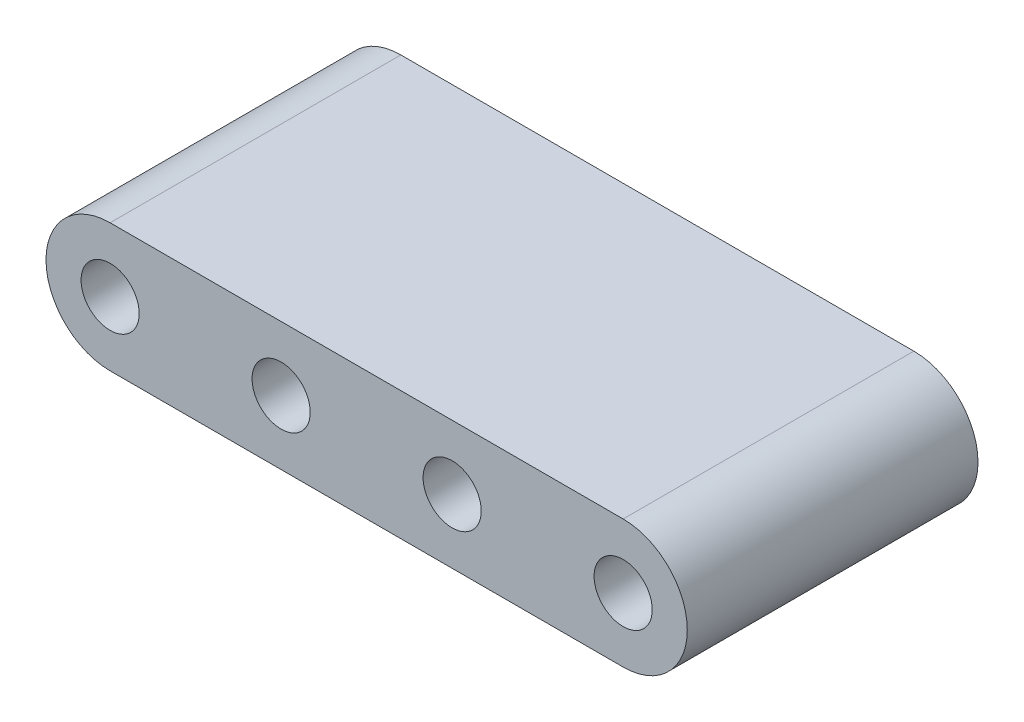
ISO-10303-21;
HEADER;
FILE_DESCRIPTION(('STEP AP214'),'2;1');
FILE_NAME('part.step','',(''),(''),'','','');
FILE_SCHEMA(('AUTOMOTIVE_DESIGN { 1 0 10303 214 1 1 1 1 }'));
ENDSEC;
DATA;
#1=APPLICATION_CONTEXT('core data for automotive mechanical design processes');
#2=APPLICATION_PROTOCOL_DEFINITION('international standard','automotive_design',2000,#1);
#3=PRODUCT_CONTEXT('',#1,'mechanical');
#4=PRODUCT('Part','Part','',(#3));
#5=PRODUCT_RELATED_PRODUCT_CATEGORY('part','',(#4));
#6=PRODUCT_DEFINITION_FORMATION('','',#4);
#7=PRODUCT_DEFINITION_CONTEXT('part definition',#1,'design');
#8=PRODUCT_DEFINITION('design','',#6,#7);
#9=PRODUCT_DEFINITION_SHAPE('','',#8);
#10=(LENGTH_UNIT() NAMED_UNIT(*) SI_UNIT(.MILLI.,.METRE.));
#11=(NAMED_UNIT(*) PLANE_ANGLE_UNIT() SI_UNIT($,.RADIAN.));
#12=(NAMED_UNIT(*) SI_UNIT($,.STERADIAN.) SOLID_ANGLE_UNIT());
#13=UNCERTAINTY_MEASURE_WITH_UNIT(LENGTH_MEASURE(1.E-05),#10,'distance_accuracy_value','');
#14=(GEOMETRIC_REPRESENTATION_CONTEXT(3) GLOBAL_UNCERTAINTY_ASSIGNED_CONTEXT((#13)) GLOBAL_UNIT_ASSIGNED_CONTEXT((#10,
#11,#12)) REPRESENTATION_CONTEXT('',''));
#15=CARTESIAN_POINT('',(0.,0.,0.));
#16=DIRECTION('',(0.,0.,1.));
#17=DIRECTION('',(1.,0.,0.));
#18=AXIS2_PLACEMENT_3D('',#15,#16,#17);
#19=CARTESIAN_POINT('',(0.,0.,34.));
#20=DIRECTION('',(0.,0.,1.));
#21=DIRECTION('',(1.,0.,0.));
#22=AXIS2_PLACEMENT_3D('',#19,#20,#21);
#23=PLANE('',#22);
#24=CARTESIAN_POINT('',(40.,0.,34.));
#25=DIRECTION('',(0.,0.,1.));
#26=DIRECTION('',(1.,0.,0.));
#27=AXIS2_PLACEMENT_3D('',#24,#25,#26);
#28=CIRCLE('',#27,3.4);
#29=CARTESIAN_POINT('',(43.4,0.,34.));
#30=VERTEX_POINT('',#29);
#31=EDGE_CURVE('E131',#30,#30,#28,.T.);
#32=ORIENTED_EDGE('',*,*,#31,.F.);
#33=EDGE_LOOP('',(#32));
#34=FACE_BOUND('',#33,.T.);
#35=CARTESIAN_POINT('',(0.,0.,34.));
#36=DIRECTION('',(0.,0.,1.));
#37=DIRECTION('',(1.,0.,0.));
#38=AXIS2_PLACEMENT_3D('',#35,#36,#37);
#39=CIRCLE('',#38,3.4);
#40=CARTESIAN_POINT('',(3.4,0.,34.));
#41=VERTEX_POINT('',#40);
#42=EDGE_CURVE('E110',#41,#41,#39,.T.);
#43=ORIENTED_EDGE('',*,*,#42,.F.);
#44=EDGE_LOOP('',(#43));
#45=FACE_BOUND('',#44,.T.);
#46=CARTESIAN_POINT('',(0.,0.,34.));
#47=DIRECTION('',(0.,0.,1.));
#48=DIRECTION('',(1.,0.,0.));
#49=AXIS2_PLACEMENT_3D('',#46,#47,#48);
#50=CIRCLE('',#49,7.5);
#51=CARTESIAN_POINT('',(0.,7.5,34.));
#52=VERTEX_POINT('',#51);
#53=CARTESIAN_POINT('',(0.,-7.5,34.));
#54=VERTEX_POINT('',#53);
#55=EDGE_CURVE('E95',#52,#54,#50,.T.);
#56=ORIENTED_EDGE('',*,*,#55,.T.);
#57=DIRECTION('',(1.,0.,0.));
#58=VECTOR('',#57,1.);
#59=CARTESIAN_POINT('',(0.,-7.5,34.));
#60=LINE('',#59,#58);
#61=CARTESIAN_POINT('',(60.,-7.5,34.));
#62=VERTEX_POINT('',#61);
#63=EDGE_CURVE('E90',#54,#62,#60,.T.);
#64=ORIENTED_EDGE('',*,*,#63,.T.);
#65=CARTESIAN_POINT('',(60.,0.,34.));
#66=DIRECTION('',(0.,0.,1.));
#67=DIRECTION('',(1.,0.,0.));
#68=AXIS2_PLACEMENT_3D('',#65,#66,#67);
#69=CIRCLE('',#68,7.5);
#70=CARTESIAN_POINT('',(60.,7.5,34.));
#71=VERTEX_POINT('',#70);
#72=EDGE_CURVE('E93',#62,#71,#69,.T.);
#73=ORIENTED_EDGE('',*,*,#72,.T.);
#74=DIRECTION('',(-1.,0.,0.));
#75=VECTOR('',#74,1.);
#76=CARTESIAN_POINT('',(0.,7.5,34.));
#77=LINE('',#76,#75);
#78=EDGE_CURVE('E60',#71,#52,#77,.T.);
#79=ORIENTED_EDGE('',*,*,#78,.T.);
#80=EDGE_LOOP('',(#56,#64,#73,#79));
#81=FACE_BOUND('',#80,.T.);
#82=CARTESIAN_POINT('',(20.,0.,34.));
#83=DIRECTION('',(0.,0.,1.));
#84=DIRECTION('',(1.,0.,0.));
#85=AXIS2_PLACEMENT_3D('',#82,#83,#84);
#86=CIRCLE('',#85,3.4);
#87=CARTESIAN_POINT('',(23.4,0.,34.));
#88=VERTEX_POINT('',#87);
#89=EDGE_CURVE('E125',#88,#88,#86,.T.);
#90=ORIENTED_EDGE('',*,*,#89,.F.);
#91=EDGE_LOOP('',(#90));
#92=FACE_BOUND('',#91,.T.);
#93=CARTESIAN_POINT('',(60.,0.,34.));
#94=DIRECTION('',(0.,0.,1.));
#95=DIRECTION('',(1.,0.,0.));
#96=AXIS2_PLACEMENT_3D('',#93,#94,#95);
#97=CIRCLE('',#96,3.4);
#98=CARTESIAN_POINT('',(63.4,0.,34.));
#99=VERTEX_POINT('',#98);
#100=EDGE_CURVE('E137',#99,#99,#97,.T.);
#101=ORIENTED_EDGE('',*,*,#100,.F.);
#102=EDGE_LOOP('',(#101));
#103=FACE_BOUND('',#102,.T.);
#104=ADVANCED_FACE('F43',(#34,#45,#81,#92,#103),#23,.T.);
#105=CARTESIAN_POINT('',(0.,0.,0.));
#106=DIRECTION('',(0.,0.,1.));
#107=DIRECTION('',(1.,0.,0.));
#108=AXIS2_PLACEMENT_3D('',#105,#106,#107);
#109=PLANE('',#108);
#110=CARTESIAN_POINT('',(0.,0.,0.));
#111=DIRECTION('',(0.,0.,1.));
#112=DIRECTION('',(1.,0.,0.));
#113=AXIS2_PLACEMENT_3D('',#110,#111,#112);
#114=CIRCLE('',#113,7.5);
#115=CARTESIAN_POINT('',(0.,7.5,0.));
#116=VERTEX_POINT('',#115);
#117=CARTESIAN_POINT('',(0.,-7.5,0.));
#118=VERTEX_POINT('',#117);
#119=EDGE_CURVE('E107',#116,#118,#114,.T.);
#120=ORIENTED_EDGE('',*,*,#119,.F.);
#121=DIRECTION('',(-1.,0.,0.));
#122=VECTOR('',#121,1.);
#123=CARTESIAN_POINT('',(0.,7.5,0.));
#124=LINE('',#123,#122);
#125=CARTESIAN_POINT('',(60.,7.5,0.));
#126=VERTEX_POINT('',#125);
#127=EDGE_CURVE('E83',#126,#116,#124,.T.);
#128=ORIENTED_EDGE('',*,*,#127,.F.);
#129=CARTESIAN_POINT('',(60.,0.,0.));
#130=DIRECTION('',(0.,0.,1.));
#131=DIRECTION('',(1.,0.,0.));
#132=AXIS2_PLACEMENT_3D('',#129,#130,#131);
#133=CIRCLE('',#132,7.5);
#134=CARTESIAN_POINT('',(60.,-7.5,0.));
#135=VERTEX_POINT('',#134);
#136=EDGE_CURVE('E77',#135,#126,#133,.T.);
#137=ORIENTED_EDGE('',*,*,#136,.F.);
#138=DIRECTION('',(1.,0.,0.));
#139=VECTOR('',#138,1.);
#140=CARTESIAN_POINT('',(0.,-7.5,0.));
#141=LINE('',#140,#139);
#142=EDGE_CURVE('E99',#118,#135,#141,.T.);
#143=ORIENTED_EDGE('',*,*,#142,.F.);
#144=EDGE_LOOP('',(#120,#128,#137,#143));
#145=FACE_BOUND('',#144,.T.);
#146=CARTESIAN_POINT('',(0.,0.,0.));
#147=DIRECTION('',(0.,0.,1.));
#148=DIRECTION('',(1.,0.,0.));
#149=AXIS2_PLACEMENT_3D('',#146,#147,#148);
#150=CIRCLE('',#149,3.4);
#151=CARTESIAN_POINT('',(3.4,0.,0.));
#152=VERTEX_POINT('',#151);
#153=EDGE_CURVE('E122',#152,#152,#150,.T.);
#154=ORIENTED_EDGE('',*,*,#153,.T.);
#155=EDGE_LOOP('',(#154));
#156=FACE_BOUND('',#155,.T.);
#157=CARTESIAN_POINT('',(20.,0.,0.));
#158=DIRECTION('',(0.,0.,1.));
#159=DIRECTION('',(1.,0.,0.));
#160=AXIS2_PLACEMENT_3D('',#157,#158,#159);
#161=CIRCLE('',#160,3.4);
#162=CARTESIAN_POINT('',(23.4,0.,0.));
#163=VERTEX_POINT('',#162);
#164=EDGE_CURVE('E128',#163,#163,#161,.T.);
#165=ORIENTED_EDGE('',*,*,#164,.T.);
#166=EDGE_LOOP('',(#165));
#167=FACE_BOUND('',#166,.T.);
#168=CARTESIAN_POINT('',(40.,0.,0.));
#169=DIRECTION('',(0.,0.,1.));
#170=DIRECTION('',(1.,0.,0.));
#171=AXIS2_PLACEMENT_3D('',#168,#169,#170);
#172=CIRCLE('',#171,3.4);
#173=CARTESIAN_POINT('',(43.4,0.,0.));
#174=VERTEX_POINT('',#173);
#175=EDGE_CURVE('E134',#174,#174,#172,.T.);
#176=ORIENTED_EDGE('',*,*,#175,.T.);
#177=EDGE_LOOP('',(#176));
#178=FACE_BOUND('',#177,.T.);
#179=CARTESIAN_POINT('',(60.,0.,0.));
#180=DIRECTION('',(0.,0.,1.));
#181=DIRECTION('',(1.,0.,0.));
#182=AXIS2_PLACEMENT_3D('',#179,#180,#181);
#183=CIRCLE('',#182,3.4);
#184=CARTESIAN_POINT('',(63.4,0.,0.));
#185=VERTEX_POINT('',#184);
#186=EDGE_CURVE('E140',#185,#185,#183,.T.);
#187=ORIENTED_EDGE('',*,*,#186,.T.);
#188=EDGE_LOOP('',(#187));
#189=FACE_BOUND('',#188,.T.);
#190=ADVANCED_FACE('F118',(#145,#156,#167,#178,#189),#109,.F.);
#191=CARTESIAN_POINT('',(0.,0.,34.));
#192=DIRECTION('',(0.,0.,-1.));
#193=DIRECTION('',(-1.,0.,0.));
#194=AXIS2_PLACEMENT_3D('',#191,#192,#193);
#195=CYLINDRICAL_SURFACE('',#194,7.5);
#196=ORIENTED_EDGE('',*,*,#119,.T.);
#197=DIRECTION('',(0.,0.,-1.));
#198=VECTOR('',#197,1.);
#199=CARTESIAN_POINT('',(0.,-7.5,34.));
#200=LINE('',#199,#198);
#201=EDGE_CURVE('E11',#54,#118,#200,.T.);
#202=ORIENTED_EDGE('',*,*,#201,.F.);
#203=ORIENTED_EDGE('',*,*,#55,.F.);
#204=DIRECTION('',(0.,0.,-1.));
#205=VECTOR('',#204,1.);
#206=CARTESIAN_POINT('',(0.,7.5,34.));
#207=LINE('',#206,#205);
#208=EDGE_CURVE('E103',#52,#116,#207,.T.);
#209=ORIENTED_EDGE('',*,*,#208,.T.);
#210=EDGE_LOOP('',(#196,#202,#203,#209));
#211=FACE_BOUND('',#210,.T.);
#212=ADVANCED_FACE('F45',(#211),#195,.T.);
#213=CARTESIAN_POINT('',(0.,-7.5,34.));
#214=DIRECTION('',(0.,1.,0.));
#215=DIRECTION('',(0.,0.,1.));
#216=AXIS2_PLACEMENT_3D('',#213,#214,#215);
#217=PLANE('',#216);
#218=ORIENTED_EDGE('',*,*,#142,.T.);
#219=DIRECTION('',(0.,0.,-1.));
#220=VECTOR('',#219,1.);
#221=CARTESIAN_POINT('',(60.,-7.5,34.));
#222=LINE('',#221,#220);
#223=EDGE_CURVE('E52',#62,#135,#222,.T.);
#224=ORIENTED_EDGE('',*,*,#223,.F.);
#225=ORIENTED_EDGE('',*,*,#63,.F.);
#226=ORIENTED_EDGE('',*,*,#201,.T.);
#227=EDGE_LOOP('',(#218,#224,#225,#226));
#228=FACE_BOUND('',#227,.T.);
#229=ADVANCED_FACE('F98',(#228),#217,.F.);
#230=CARTESIAN_POINT('',(60.,0.,34.));
#231=DIRECTION('',(0.,0.,-1.));
#232=DIRECTION('',(-1.,0.,0.));
#233=AXIS2_PLACEMENT_3D('',#230,#231,#232);
#234=CYLINDRICAL_SURFACE('',#233,7.5);
#235=ORIENTED_EDGE('',*,*,#136,.T.);
#236=DIRECTION('',(0.,0.,-1.));
#237=VECTOR('',#236,1.);
#238=CARTESIAN_POINT('',(60.,7.5,34.));
#239=LINE('',#238,#237);
#240=EDGE_CURVE('E100',#71,#126,#239,.T.);
#241=ORIENTED_EDGE('',*,*,#240,.F.);
#242=ORIENTED_EDGE('',*,*,#72,.F.);
#243=ORIENTED_EDGE('',*,*,#223,.T.);
#244=EDGE_LOOP('',(#235,#241,#242,#243));
#245=FACE_BOUND('',#244,.T.);
#246=ADVANCED_FACE('F101',(#245),#234,.T.);
#247=CARTESIAN_POINT('',(0.,7.5,34.));
#248=DIRECTION('',(0.,-1.,0.));
#249=DIRECTION('',(0.,0.,-1.));
#250=AXIS2_PLACEMENT_3D('',#247,#248,#249);
#251=PLANE('',#250);
#252=ORIENTED_EDGE('',*,*,#127,.T.);
#253=ORIENTED_EDGE('',*,*,#208,.F.);
#254=ORIENTED_EDGE('',*,*,#78,.F.);
#255=ORIENTED_EDGE('',*,*,#240,.T.);
#256=EDGE_LOOP('',(#252,#253,#254,#255));
#257=FACE_BOUND('',#256,.T.);
#258=ADVANCED_FACE('F115',(#257),#251,.F.);
#259=CARTESIAN_POINT('',(0.,0.,34.));
#260=DIRECTION('',(0.,0.,-1.));
#261=DIRECTION('',(-1.,0.,0.));
#262=AXIS2_PLACEMENT_3D('',#259,#260,#261);
#263=CYLINDRICAL_SURFACE('',#262,3.4);
#264=ORIENTED_EDGE('',*,*,#42,.T.);
#265=EDGE_LOOP('',(#264));
#266=FACE_BOUND('',#265,.T.);
#267=ORIENTED_EDGE('',*,*,#153,.F.);
#268=EDGE_LOOP('',(#267));
#269=FACE_BOUND('',#268,.T.);
#270=ADVANCED_FACE('F159',(#266,#269),#263,.F.);
#271=CARTESIAN_POINT('',(20.,0.,34.));
#272=DIRECTION('',(0.,0.,-1.));
#273=DIRECTION('',(-1.,0.,0.));
#274=AXIS2_PLACEMENT_3D('',#271,#272,#273);
#275=CYLINDRICAL_SURFACE('',#274,3.4);
#276=ORIENTED_EDGE('',*,*,#89,.T.);
#277=EDGE_LOOP('',(#276));
#278=FACE_BOUND('',#277,.T.);
#279=ORIENTED_EDGE('',*,*,#164,.F.);
#280=EDGE_LOOP('',(#279));
#281=FACE_BOUND('',#280,.T.);
#282=ADVANCED_FACE('F213',(#278,#281),#275,.F.);
#283=CARTESIAN_POINT('',(40.,0.,34.));
#284=DIRECTION('',(0.,0.,-1.));
#285=DIRECTION('',(-1.,0.,0.));
#286=AXIS2_PLACEMENT_3D('',#283,#284,#285);
#287=CYLINDRICAL_SURFACE('',#286,3.4);
#288=ORIENTED_EDGE('',*,*,#31,.T.);
#289=EDGE_LOOP('',(#288));
#290=FACE_BOUND('',#289,.T.);
#291=ORIENTED_EDGE('',*,*,#175,.F.);
#292=EDGE_LOOP('',(#291));
#293=FACE_BOUND('',#292,.T.);
#294=ADVANCED_FACE('F222',(#290,#293),#287,.F.);
#295=CARTESIAN_POINT('',(60.,0.,34.));
#296=DIRECTION('',(0.,0.,-1.));
#297=DIRECTION('',(-1.,0.,0.));
#298=AXIS2_PLACEMENT_3D('',#295,#296,#297);
#299=CYLINDRICAL_SURFACE('',#298,3.4);
#300=ORIENTED_EDGE('',*,*,#100,.T.);
#301=EDGE_LOOP('',(#300));
#302=FACE_BOUND('',#301,.T.);
#303=ORIENTED_EDGE('',*,*,#186,.F.);
#304=EDGE_LOOP('',(#303));
#305=FACE_BOUND('',#304,.T.);
#306=ADVANCED_FACE('F146',(#302,#305),#299,.F.);
#307=CLOSED_SHELL('',(#104,#190,#212,#229,#246,#258,#270,#282,#294,#306));
#308=MANIFOLD_SOLID_BREP('B2',#307);
#309=ADVANCED_BREP_SHAPE_REPRESENTATION('',(#18,#308),#14);
#310=SHAPE_DEFINITION_REPRESENTATION(#9,#309);
ENDSEC;
END-ISO-10303-21;
